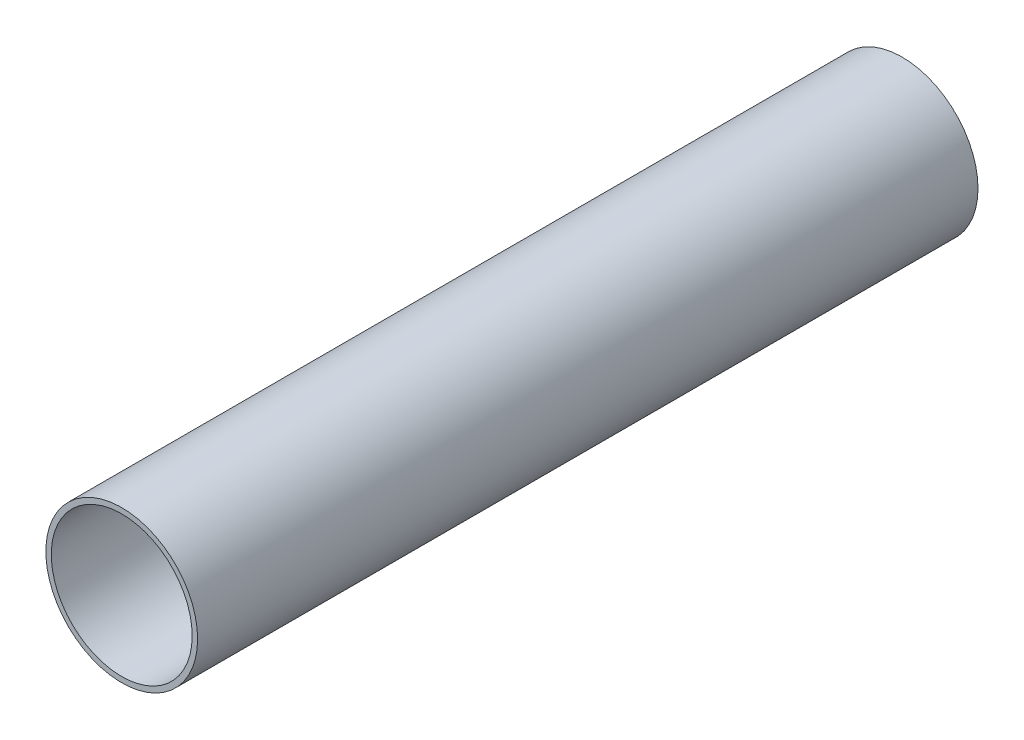
ISO-10303-21;
HEADER;
FILE_DESCRIPTION(('STEP AP214'),'2;1');
FILE_NAME('part.step','',(''),(''),'','','');
FILE_SCHEMA(('AUTOMOTIVE_DESIGN { 1 0 10303 214 1 1 1 1 }'));
ENDSEC;
DATA;
#1=APPLICATION_CONTEXT('core data for automotive mechanical design processes');
#2=APPLICATION_PROTOCOL_DEFINITION('international standard','automotive_design',2000,#1);
#3=PRODUCT_CONTEXT('',#1,'mechanical');
#4=PRODUCT('Part','Part','',(#3));
#5=PRODUCT_RELATED_PRODUCT_CATEGORY('part','',(#4));
#6=PRODUCT_DEFINITION_FORMATION('','',#4);
#7=PRODUCT_DEFINITION_CONTEXT('part definition',#1,'design');
#8=PRODUCT_DEFINITION('design','',#6,#7);
#9=PRODUCT_DEFINITION_SHAPE('','',#8);
#10=(LENGTH_UNIT() NAMED_UNIT(*) SI_UNIT(.MILLI.,.METRE.));
#11=(NAMED_UNIT(*) PLANE_ANGLE_UNIT() SI_UNIT($,.RADIAN.));
#12=(NAMED_UNIT(*) SI_UNIT($,.STERADIAN.) SOLID_ANGLE_UNIT());
#13=UNCERTAINTY_MEASURE_WITH_UNIT(LENGTH_MEASURE(1.E-05),#10,'distance_accuracy_value','');
#14=(GEOMETRIC_REPRESENTATION_CONTEXT(3) GLOBAL_UNCERTAINTY_ASSIGNED_CONTEXT((#13)) GLOBAL_UNIT_ASSIGNED_CONTEXT((#10,
#11,#12)) REPRESENTATION_CONTEXT('',''));
#15=CARTESIAN_POINT('',(0.,0.,0.));
#16=DIRECTION('',(0.,0.,1.));
#17=DIRECTION('',(1.,0.,0.));
#18=AXIS2_PLACEMENT_3D('',#15,#16,#17);
#19=CARTESIAN_POINT('',(0.,0.,914.4));
#20=DIRECTION('',(0.,0.,1.));
#21=DIRECTION('',(1.,0.,0.));
#22=AXIS2_PLACEMENT_3D('',#19,#20,#21);
#23=PLANE('',#22);
#24=CARTESIAN_POINT('',(0.,0.,914.4));
#25=DIRECTION('',(0.,0.,1.));
#26=DIRECTION('',(1.,0.,0.));
#27=AXIS2_PLACEMENT_3D('',#24,#25,#26);
#28=CIRCLE('',#27,88.9);
#29=CARTESIAN_POINT('',(88.9,0.,914.4));
#30=VERTEX_POINT('',#29);
#31=EDGE_CURVE('E10',#30,#30,#28,.T.);
#32=ORIENTED_EDGE('',*,*,#31,.T.);
#33=EDGE_LOOP('',(#32));
#34=FACE_BOUND('',#33,.T.);
#35=CARTESIAN_POINT('',(0.,0.,914.4));
#36=DIRECTION('',(0.,0.,1.));
#37=DIRECTION('',(1.,0.,0.));
#38=AXIS2_PLACEMENT_3D('',#35,#36,#37);
#39=CIRCLE('',#38,82.55);
#40=CARTESIAN_POINT('',(82.55,0.,914.4));
#41=VERTEX_POINT('',#40);
#42=EDGE_CURVE('E50',#41,#41,#39,.T.);
#43=ORIENTED_EDGE('',*,*,#42,.F.);
#44=EDGE_LOOP('',(#43));
#45=FACE_BOUND('',#44,.T.);
#46=ADVANCED_FACE('F37',(#34,#45),#23,.T.);
#47=CARTESIAN_POINT('',(0.,0.,0.));
#48=DIRECTION('',(0.,0.,1.));
#49=DIRECTION('',(1.,0.,0.));
#50=AXIS2_PLACEMENT_3D('',#47,#48,#49);
#51=PLANE('',#50);
#52=CARTESIAN_POINT('',(0.,0.,0.));
#53=DIRECTION('',(0.,0.,1.));
#54=DIRECTION('',(1.,0.,0.));
#55=AXIS2_PLACEMENT_3D('',#52,#53,#54);
#56=CIRCLE('',#55,88.9);
#57=CARTESIAN_POINT('',(88.9,0.,0.));
#58=VERTEX_POINT('',#57);
#59=EDGE_CURVE('E41',#58,#58,#56,.T.);
#60=ORIENTED_EDGE('',*,*,#59,.F.);
#61=EDGE_LOOP('',(#60));
#62=FACE_BOUND('',#61,.T.);
#63=CARTESIAN_POINT('',(0.,0.,0.));
#64=DIRECTION('',(0.,0.,1.));
#65=DIRECTION('',(1.,0.,0.));
#66=AXIS2_PLACEMENT_3D('',#63,#64,#65);
#67=CIRCLE('',#66,82.55);
#68=CARTESIAN_POINT('',(82.55,0.,0.));
#69=VERTEX_POINT('',#68);
#70=EDGE_CURVE('E52',#69,#69,#67,.T.);
#71=ORIENTED_EDGE('',*,*,#70,.T.);
#72=EDGE_LOOP('',(#71));
#73=FACE_BOUND('',#72,.T.);
#74=ADVANCED_FACE('F64',(#62,#73),#51,.F.);
#75=CARTESIAN_POINT('',(0.,0.,914.4));
#76=DIRECTION('',(0.,0.,-1.));
#77=DIRECTION('',(-1.,0.,0.));
#78=AXIS2_PLACEMENT_3D('',#75,#76,#77);
#79=CYLINDRICAL_SURFACE('',#78,88.9);
#80=ORIENTED_EDGE('',*,*,#31,.F.);
#81=EDGE_LOOP('',(#80));
#82=FACE_BOUND('',#81,.T.);
#83=ORIENTED_EDGE('',*,*,#59,.T.);
#84=EDGE_LOOP('',(#83));
#85=FACE_BOUND('',#84,.T.);
#86=ADVANCED_FACE('F39',(#82,#85),#79,.T.);
#87=CARTESIAN_POINT('',(0.,0.,914.4));
#88=DIRECTION('',(0.,0.,-1.));
#89=DIRECTION('',(-1.,0.,0.));
#90=AXIS2_PLACEMENT_3D('',#87,#88,#89);
#91=CYLINDRICAL_SURFACE('',#90,82.55);
#92=ORIENTED_EDGE('',*,*,#42,.T.);
#93=EDGE_LOOP('',(#92));
#94=FACE_BOUND('',#93,.T.);
#95=ORIENTED_EDGE('',*,*,#70,.F.);
#96=EDGE_LOOP('',(#95));
#97=FACE_BOUND('',#96,.T.);
#98=ADVANCED_FACE('F60',(#94,#97),#91,.F.);
#99=CLOSED_SHELL('',(#46,#74,#86,#98));
#100=MANIFOLD_SOLID_BREP('B2',#99);
#101=ADVANCED_BREP_SHAPE_REPRESENTATION('',(#18,#100),#14);
#102=SHAPE_DEFINITION_REPRESENTATION(#9,#101);
ENDSEC;
END-ISO-10303-21;
